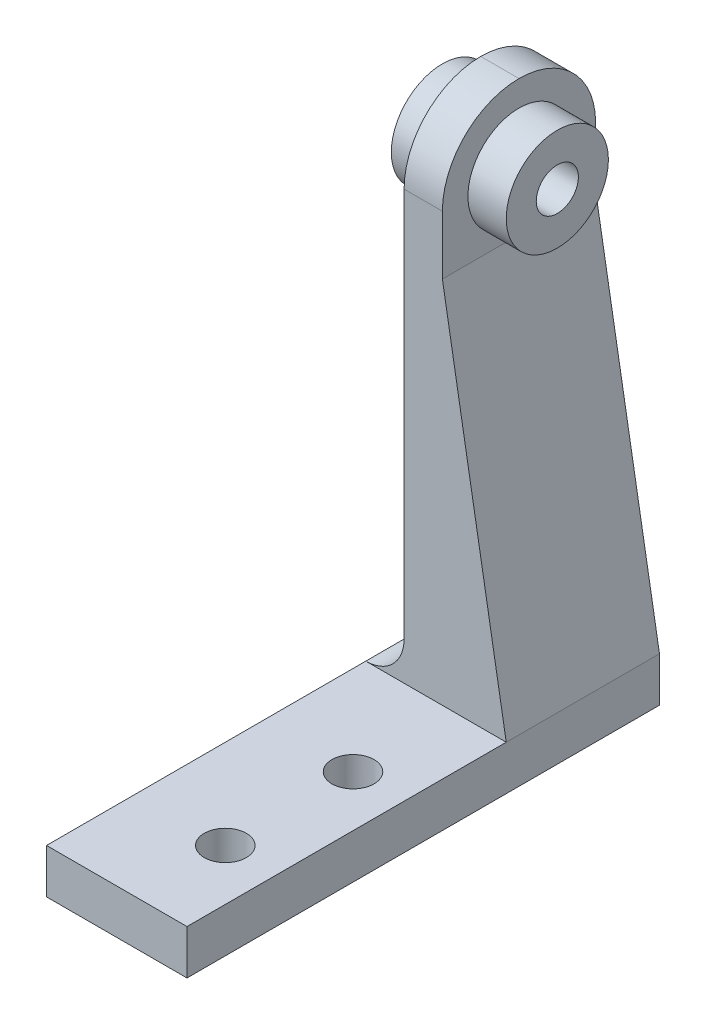
ISO-10303-21;
HEADER;
FILE_DESCRIPTION(('STEP AP214'),'2;1');
FILE_NAME('part.step','',(''),(''),'','','');
FILE_SCHEMA(('AUTOMOTIVE_DESIGN { 1 0 10303 214 1 1 1 1 }'));
ENDSEC;
DATA;
#1=APPLICATION_CONTEXT('core data for automotive mechanical design processes');
#2=APPLICATION_PROTOCOL_DEFINITION('international standard','automotive_design',2000,#1);
#3=PRODUCT_CONTEXT('',#1,'mechanical');
#4=PRODUCT('Part','Part','',(#3));
#5=PRODUCT_RELATED_PRODUCT_CATEGORY('part','',(#4));
#6=PRODUCT_DEFINITION_FORMATION('','',#4);
#7=PRODUCT_DEFINITION_CONTEXT('part definition',#1,'design');
#8=PRODUCT_DEFINITION('design','',#6,#7);
#9=PRODUCT_DEFINITION_SHAPE('','',#8);
#10=(LENGTH_UNIT() NAMED_UNIT(*) SI_UNIT(.MILLI.,.METRE.));
#11=(NAMED_UNIT(*) PLANE_ANGLE_UNIT() SI_UNIT($,.RADIAN.));
#12=(NAMED_UNIT(*) SI_UNIT($,.STERADIAN.) SOLID_ANGLE_UNIT());
#13=UNCERTAINTY_MEASURE_WITH_UNIT(LENGTH_MEASURE(1.E-05),#10,'distance_accuracy_value','');
#14=(GEOMETRIC_REPRESENTATION_CONTEXT(3) GLOBAL_UNCERTAINTY_ASSIGNED_CONTEXT((#13)) GLOBAL_UNIT_ASSIGNED_CONTEXT((#10,
#11,#12)) REPRESENTATION_CONTEXT('',''));
#15=CARTESIAN_POINT('',(0.,0.,0.));
#16=DIRECTION('',(0.,0.,1.));
#17=DIRECTION('',(1.,0.,0.));
#18=AXIS2_PLACEMENT_3D('',#15,#16,#17);
#19=CARTESIAN_POINT('',(3.,0.,0.));
#20=DIRECTION('',(1.,0.,0.));
#21=DIRECTION('',(0.,0.,-1.));
#22=AXIS2_PLACEMENT_3D('',#19,#20,#21);
#23=PLANE('',#22);
#24=CARTESIAN_POINT('',(3.,14.,0.));
#25=DIRECTION('',(1.,0.,0.));
#26=DIRECTION('',(0.,0.,-1.));
#27=AXIS2_PLACEMENT_3D('',#24,#25,#26);
#28=CIRCLE('',#27,4.);
#29=CARTESIAN_POINT('',(3.,14.,-4.));
#30=VERTEX_POINT('',#29);
#31=EDGE_CURVE('E172',#30,#30,#28,.T.);
#32=ORIENTED_EDGE('',*,*,#31,.F.);
#33=EDGE_LOOP('',(#32));
#34=FACE_BOUND('',#33,.T.);
#35=DIRECTION('',(0.,-1.,0.));
#36=VECTOR('',#35,1.);
#37=CARTESIAN_POINT('',(3.,20.,6.));
#38=LINE('',#37,#36);
#39=CARTESIAN_POINT('',(3.,14.,6.));
#40=VERTEX_POINT('',#39);
#41=CARTESIAN_POINT('',(3.,9.40062750597729,6.));
#42=VERTEX_POINT('',#41);
#43=EDGE_CURVE('E180',#40,#42,#38,.T.);
#44=ORIENTED_EDGE('',*,*,#43,.T.);
#45=DIRECTION('',(0.,0.,1.));
#46=VECTOR('',#45,1.);
#47=CARTESIAN_POINT('',(3.,9.40062750597729,6.));
#48=LINE('',#47,#46);
#49=CARTESIAN_POINT('',(3.,9.40062750597729,-6.));
#50=VERTEX_POINT('',#49);
#51=EDGE_CURVE('E209',#50,#42,#48,.T.);
#52=ORIENTED_EDGE('',*,*,#51,.F.);
#53=DIRECTION('',(0.,1.,0.));
#54=VECTOR('',#53,1.);
#55=CARTESIAN_POINT('',(3.,20.,-6.));
#56=LINE('',#55,#54);
#57=CARTESIAN_POINT('',(3.,14.,-6.));
#58=VERTEX_POINT('',#57);
#59=EDGE_CURVE('E138',#50,#58,#56,.T.);
#60=ORIENTED_EDGE('',*,*,#59,.T.);
#61=CARTESIAN_POINT('',(3.,14.,0.));
#62=DIRECTION('',(1.,0.,0.));
#63=DIRECTION('',(0.,0.,-1.));
#64=AXIS2_PLACEMENT_3D('',#61,#62,#63);
#65=CIRCLE('',#64,6.);
#66=CARTESIAN_POINT('',(3.,20.,0.));
#67=VERTEX_POINT('',#66);
#68=EDGE_CURVE('E196',#58,#67,#65,.T.);
#69=ORIENTED_EDGE('',*,*,#68,.T.);
#70=CARTESIAN_POINT('',(3.,14.,0.));
#71=DIRECTION('',(1.,0.,0.));
#72=DIRECTION('',(0.,0.,-1.));
#73=AXIS2_PLACEMENT_3D('',#70,#71,#72);
#74=CIRCLE('',#73,6.);
#75=EDGE_CURVE('E194',#67,#40,#74,.T.);
#76=ORIENTED_EDGE('',*,*,#75,.T.);
#77=EDGE_LOOP('',(#44,#52,#60,#69,#76));
#78=FACE_BOUND('',#77,.T.);
#79=ADVANCED_FACE('F43',(#34,#78),#23,.T.);
#80=CARTESIAN_POINT('',(3.,-19.5101273377847,31.));
#81=DIRECTION('',(0.,-1.,0.));
#82=DIRECTION('',(0.,0.,-1.));
#83=AXIS2_PLACEMENT_3D('',#80,#81,#82);
#84=PLANE('',#83);
#85=CARTESIAN_POINT('',(4.,-19.5101273377847,14.));
#86=DIRECTION('',(0.,1.,0.));
#87=DIRECTION('',(0.,0.,1.));
#88=AXIS2_PLACEMENT_3D('',#85,#86,#87);
#89=CIRCLE('',#88,1.65);
#90=CARTESIAN_POINT('',(4.,-19.5101273377847,15.65));
#91=VERTEX_POINT('',#90);
#92=EDGE_CURVE('E205',#91,#91,#89,.T.);
#93=ORIENTED_EDGE('',*,*,#92,.F.);
#94=EDGE_LOOP('',(#93));
#95=FACE_BOUND('',#94,.T.);
#96=CARTESIAN_POINT('',(4.,-19.5101273377847,24.));
#97=DIRECTION('',(0.,1.,0.));
#98=DIRECTION('',(0.,0.,1.));
#99=AXIS2_PLACEMENT_3D('',#96,#97,#98);
#100=CIRCLE('',#99,1.65);
#101=CARTESIAN_POINT('',(4.,-19.5101273377847,25.65));
#102=VERTEX_POINT('',#101);
#103=EDGE_CURVE('E131',#102,#102,#100,.T.);
#104=ORIENTED_EDGE('',*,*,#103,.F.);
#105=EDGE_LOOP('',(#104));
#106=FACE_BOUND('',#105,.T.);
#107=DIRECTION('',(-1.,0.,0.));
#108=VECTOR('',#107,1.);
#109=CARTESIAN_POINT('',(3.,-19.5101273377847,6.));
#110=LINE('',#109,#108);
#111=CARTESIAN_POINT('',(8.,-19.5101273377847,6.));
#112=VERTEX_POINT('',#111);
#113=CARTESIAN_POINT('',(-3.,-19.5101273377847,6.));
#114=VERTEX_POINT('',#113);
#115=EDGE_CURVE('E168',#112,#114,#110,.T.);
#116=ORIENTED_EDGE('',*,*,#115,.T.);
#117=DIRECTION('',(0.,0.,-1.));
#118=VECTOR('',#117,1.);
#119=CARTESIAN_POINT('',(-3.,-19.5101273377847,31.));
#120=LINE('',#119,#118);
#121=CARTESIAN_POINT('',(-3.,-19.5101273377847,31.));
#122=VERTEX_POINT('',#121);
#123=EDGE_CURVE('E223',#122,#114,#120,.T.);
#124=ORIENTED_EDGE('',*,*,#123,.F.);
#125=DIRECTION('',(-1.,0.,0.));
#126=VECTOR('',#125,1.);
#127=CARTESIAN_POINT('',(3.,-19.5101273377847,31.));
#128=LINE('',#127,#126);
#129=CARTESIAN_POINT('',(8.,-19.5101273377847,31.));
#130=VERTEX_POINT('',#129);
#131=EDGE_CURVE('E154',#130,#122,#128,.T.);
#132=ORIENTED_EDGE('',*,*,#131,.F.);
#133=DIRECTION('',(0.,0.,1.));
#134=VECTOR('',#133,1.);
#135=CARTESIAN_POINT('',(8.,-19.5101273377847,31.));
#136=LINE('',#135,#134);
#137=EDGE_CURVE('E145',#112,#130,#136,.T.);
#138=ORIENTED_EDGE('',*,*,#137,.F.);
#139=EDGE_LOOP('',(#116,#124,#132,#138));
#140=FACE_BOUND('',#139,.T.);
#141=ADVANCED_FACE('F264',(#95,#106,#140),#84,.F.);
#142=CARTESIAN_POINT('',(0.,0.,0.));
#143=DIRECTION('',(1.,0.,0.));
#144=DIRECTION('',(0.,0.,-1.));
#145=AXIS2_PLACEMENT_3D('',#142,#143,#144);
#146=PLANE('',#145);
#147=CARTESIAN_POINT('',(0.,14.,0.));
#148=DIRECTION('',(-1.,0.,0.));
#149=DIRECTION('',(0.,0.,1.));
#150=AXIS2_PLACEMENT_3D('',#147,#148,#149);
#151=CIRCLE('',#150,4.);
#152=CARTESIAN_POINT('',(0.,14.,4.));
#153=VERTEX_POINT('',#152);
#154=EDGE_CURVE('E165',#153,#153,#151,.T.);
#155=ORIENTED_EDGE('',*,*,#154,.F.);
#156=EDGE_LOOP('',(#155));
#157=FACE_BOUND('',#156,.T.);
#158=DIRECTION('',(0.,1.,0.));
#159=VECTOR('',#158,1.);
#160=CARTESIAN_POINT('',(0.,20.,-6.));
#161=LINE('',#160,#159);
#162=CARTESIAN_POINT('',(0.,-16.5101273377847,-6.));
#163=VERTEX_POINT('',#162);
#164=CARTESIAN_POINT('',(0.,14.,-6.));
#165=VERTEX_POINT('',#164);
#166=EDGE_CURVE('E185',#163,#165,#161,.T.);
#167=ORIENTED_EDGE('',*,*,#166,.F.);
#168=DIRECTION('',(0.,0.,-1.));
#169=VECTOR('',#168,1.);
#170=CARTESIAN_POINT('',(0.,-16.5101273377847,6.));
#171=LINE('',#170,#169);
#172=CARTESIAN_POINT('',(0.,-16.5101273377847,6.));
#173=VERTEX_POINT('',#172);
#174=EDGE_CURVE('E66',#163,#173,#171,.F.);
#175=ORIENTED_EDGE('',*,*,#174,.T.);
#176=DIRECTION('',(0.,-1.,0.));
#177=VECTOR('',#176,1.);
#178=CARTESIAN_POINT('',(0.,20.,6.));
#179=LINE('',#178,#177);
#180=CARTESIAN_POINT('',(0.,14.,6.));
#181=VERTEX_POINT('',#180);
#182=EDGE_CURVE('E181',#181,#173,#179,.T.);
#183=ORIENTED_EDGE('',*,*,#182,.F.);
#184=CARTESIAN_POINT('',(0.,14.,0.));
#185=DIRECTION('',(1.,0.,0.));
#186=DIRECTION('',(0.,0.,-1.));
#187=AXIS2_PLACEMENT_3D('',#184,#185,#186);
#188=CIRCLE('',#187,6.);
#189=CARTESIAN_POINT('',(0.,20.,0.));
#190=VERTEX_POINT('',#189);
#191=EDGE_CURVE('E184',#181,#190,#188,.F.);
#192=ORIENTED_EDGE('',*,*,#191,.T.);
#193=CARTESIAN_POINT('',(0.,14.,0.));
#194=DIRECTION('',(1.,0.,0.));
#195=DIRECTION('',(0.,0.,-1.));
#196=AXIS2_PLACEMENT_3D('',#193,#194,#195);
#197=CIRCLE('',#196,6.);
#198=EDGE_CURVE('E189',#190,#165,#197,.F.);
#199=ORIENTED_EDGE('',*,*,#198,.T.);
#200=EDGE_LOOP('',(#167,#175,#183,#192,#199));
#201=FACE_BOUND('',#200,.T.);
#202=ADVANCED_FACE('F252',(#157,#201),#146,.F.);
#203=CARTESIAN_POINT('',(3.,20.,6.));
#204=DIRECTION('',(0.,0.,-1.));
#205=DIRECTION('',(0.,1.,0.));
#206=AXIS2_PLACEMENT_3D('',#203,#204,#205);
#207=PLANE('',#206);
#208=ORIENTED_EDGE('',*,*,#115,.F.);
#209=DIRECTION('',(0.170416196104557,-0.985372173397064,0.));
#210=VECTOR('',#209,1.);
#211=CARTESIAN_POINT('',(3.,9.40062750597729,6.));
#212=LINE('',#211,#210);
#213=EDGE_CURVE('E127',#42,#112,#212,.T.);
#214=ORIENTED_EDGE('',*,*,#213,.F.);
#215=ORIENTED_EDGE('',*,*,#43,.F.);
#216=DIRECTION('',(-1.,0.,0.));
#217=VECTOR('',#216,1.);
#218=CARTESIAN_POINT('',(3.,14.,6.));
#219=LINE('',#218,#217);
#220=EDGE_CURVE('E169',#40,#181,#219,.T.);
#221=ORIENTED_EDGE('',*,*,#220,.T.);
#222=ORIENTED_EDGE('',*,*,#182,.T.);
#223=CARTESIAN_POINT('',(-3.,-16.5101273377847,6.));
#224=DIRECTION('',(0.,0.,-1.));
#225=DIRECTION('',(0.,1.,0.));
#226=AXIS2_PLACEMENT_3D('',#223,#224,#225);
#227=CIRCLE('',#226,3.);
#228=EDGE_CURVE('E12',#173,#114,#227,.T.);
#229=ORIENTED_EDGE('',*,*,#228,.T.);
#230=EDGE_LOOP('',(#208,#214,#215,#221,#222,#229));
#231=FACE_BOUND('',#230,.T.);
#232=ADVANCED_FACE('F248',(#231),#207,.F.);
#233=CARTESIAN_POINT('',(3.,20.,-6.));
#234=DIRECTION('',(0.,0.,1.));
#235=DIRECTION('',(0.,-1.,0.));
#236=AXIS2_PLACEMENT_3D('',#233,#234,#235);
#237=PLANE('',#236);
#238=ORIENTED_EDGE('',*,*,#59,.F.);
#239=DIRECTION('',(0.170416196104557,-0.985372173397064,0.));
#240=VECTOR('',#239,1.);
#241=CARTESIAN_POINT('',(3.,9.40062750597729,-6.));
#242=LINE('',#241,#240);
#243=CARTESIAN_POINT('',(8.,-19.5101273377847,-6.));
#244=VERTEX_POINT('',#243);
#245=EDGE_CURVE('E124',#50,#244,#242,.T.);
#246=ORIENTED_EDGE('',*,*,#245,.T.);
#247=DIRECTION('',(0.,1.,0.));
#248=VECTOR('',#247,1.);
#249=CARTESIAN_POINT('',(8.,-19.5101273377847,-6.));
#250=LINE('',#249,#248);
#251=CARTESIAN_POINT('',(8.,-23.,-6.));
#252=VERTEX_POINT('',#251);
#253=EDGE_CURVE('E136',#252,#244,#250,.T.);
#254=ORIENTED_EDGE('',*,*,#253,.F.);
#255=DIRECTION('',(1.,0.,0.));
#256=VECTOR('',#255,1.);
#257=CARTESIAN_POINT('',(0.,-23.,-6.));
#258=LINE('',#257,#256);
#259=CARTESIAN_POINT('',(-3.,-23.,-6.));
#260=VERTEX_POINT('',#259);
#261=EDGE_CURVE('E156',#260,#252,#258,.T.);
#262=ORIENTED_EDGE('',*,*,#261,.F.);
#263=DIRECTION('',(0.,-1.,0.));
#264=VECTOR('',#263,1.);
#265=CARTESIAN_POINT('',(-3.,-19.5101273377847,-6.));
#266=LINE('',#265,#264);
#267=CARTESIAN_POINT('',(-3.,-19.5101273377847,-6.));
#268=VERTEX_POINT('',#267);
#269=EDGE_CURVE('E226',#268,#260,#266,.T.);
#270=ORIENTED_EDGE('',*,*,#269,.F.);
#271=CARTESIAN_POINT('',(-3.,-16.5101273377847,-6.00000000000001));
#272=DIRECTION('',(0.,0.,1.));
#273=DIRECTION('',(0.,-1.,0.));
#274=AXIS2_PLACEMENT_3D('',#271,#272,#273);
#275=CIRCLE('',#274,3.);
#276=EDGE_CURVE('E52',#268,#163,#275,.T.);
#277=ORIENTED_EDGE('',*,*,#276,.T.);
#278=ORIENTED_EDGE('',*,*,#166,.T.);
#279=DIRECTION('',(-1.,0.,0.));
#280=VECTOR('',#279,1.);
#281=CARTESIAN_POINT('',(3.,14.,-6.));
#282=LINE('',#281,#280);
#283=EDGE_CURVE('E192',#165,#58,#282,.F.);
#284=ORIENTED_EDGE('',*,*,#283,.T.);
#285=EDGE_LOOP('',(#238,#246,#254,#262,#270,#277,#278,#284));
#286=FACE_BOUND('',#285,.T.);
#287=ADVANCED_FACE('F135',(#286),#237,.F.);
#288=CARTESIAN_POINT('',(3.,14.,0.));
#289=DIRECTION('',(-1.,0.,0.));
#290=DIRECTION('',(0.,0.,1.));
#291=AXIS2_PLACEMENT_3D('',#288,#289,#290);
#292=CYLINDRICAL_SURFACE('',#291,1.65);
#293=CARTESIAN_POINT('',(6.,14.,0.));
#294=DIRECTION('',(1.,0.,0.));
#295=DIRECTION('',(0.,0.,-1.));
#296=AXIS2_PLACEMENT_3D('',#293,#294,#295);
#297=CIRCLE('',#296,1.65);
#298=CARTESIAN_POINT('',(6.,14.,-1.65));
#299=VERTEX_POINT('',#298);
#300=EDGE_CURVE('E164',#299,#299,#297,.F.);
#301=ORIENTED_EDGE('',*,*,#300,.F.);
#302=EDGE_LOOP('',(#301));
#303=FACE_BOUND('',#302,.T.);
#304=CARTESIAN_POINT('',(-3.,14.,0.));
#305=DIRECTION('',(-1.,0.,0.));
#306=DIRECTION('',(0.,0.,1.));
#307=AXIS2_PLACEMENT_3D('',#304,#305,#306);
#308=CIRCLE('',#307,1.65);
#309=CARTESIAN_POINT('',(-3.,14.,1.65));
#310=VERTEX_POINT('',#309);
#311=EDGE_CURVE('E158',#310,#310,#308,.T.);
#312=ORIENTED_EDGE('',*,*,#311,.T.);
#313=EDGE_LOOP('',(#312));
#314=FACE_BOUND('',#313,.T.);
#315=ADVANCED_FACE('F276',(#303,#314),#292,.F.);
#316=CARTESIAN_POINT('',(3.,14.,0.));
#317=DIRECTION('',(-1.,0.,0.));
#318=DIRECTION('',(0.,0.,1.));
#319=AXIS2_PLACEMENT_3D('',#316,#317,#318);
#320=CYLINDRICAL_SURFACE('',#319,6.);
#321=ORIENTED_EDGE('',*,*,#220,.F.);
#322=ORIENTED_EDGE('',*,*,#75,.F.);
#323=DIRECTION('',(-1.,0.,0.));
#324=VECTOR('',#323,1.);
#325=CARTESIAN_POINT('',(3.,20.,0.));
#326=LINE('',#325,#324);
#327=EDGE_CURVE('E176',#190,#67,#326,.F.);
#328=ORIENTED_EDGE('',*,*,#327,.F.);
#329=ORIENTED_EDGE('',*,*,#191,.F.);
#330=EDGE_LOOP('',(#321,#322,#328,#329));
#331=FACE_BOUND('',#330,.T.);
#332=ADVANCED_FACE('F255',(#331),#320,.T.);
#333=CARTESIAN_POINT('',(3.,14.,0.));
#334=DIRECTION('',(-1.,0.,0.));
#335=DIRECTION('',(0.,0.,1.));
#336=AXIS2_PLACEMENT_3D('',#333,#334,#335);
#337=CYLINDRICAL_SURFACE('',#336,6.);
#338=ORIENTED_EDGE('',*,*,#68,.F.);
#339=ORIENTED_EDGE('',*,*,#283,.F.);
#340=ORIENTED_EDGE('',*,*,#198,.F.);
#341=ORIENTED_EDGE('',*,*,#327,.T.);
#342=EDGE_LOOP('',(#338,#339,#340,#341));
#343=FACE_BOUND('',#342,.T.);
#344=ADVANCED_FACE('F261',(#343),#337,.T.);
#345=CARTESIAN_POINT('',(6.,14.,0.));
#346=DIRECTION('',(-1.,0.,0.));
#347=DIRECTION('',(0.,0.,1.));
#348=AXIS2_PLACEMENT_3D('',#345,#346,#347);
#349=CYLINDRICAL_SURFACE('',#348,4.);
#350=CARTESIAN_POINT('',(6.,14.,0.));
#351=DIRECTION('',(1.,0.,0.));
#352=DIRECTION('',(0.,0.,-1.));
#353=AXIS2_PLACEMENT_3D('',#350,#351,#352);
#354=CIRCLE('',#353,4.);
#355=CARTESIAN_POINT('',(6.,14.,-4.));
#356=VERTEX_POINT('',#355);
#357=EDGE_CURVE('E173',#356,#356,#354,.T.);
#358=ORIENTED_EDGE('',*,*,#357,.F.);
#359=EDGE_LOOP('',(#358));
#360=FACE_BOUND('',#359,.T.);
#361=ORIENTED_EDGE('',*,*,#31,.T.);
#362=EDGE_LOOP('',(#361));
#363=FACE_BOUND('',#362,.T.);
#364=ADVANCED_FACE('F286',(#360,#363),#349,.T.);
#365=CARTESIAN_POINT('',(6.,14.,0.));
#366=DIRECTION('',(1.,0.,0.));
#367=DIRECTION('',(0.,0.,-1.));
#368=AXIS2_PLACEMENT_3D('',#365,#366,#367);
#369=PLANE('',#368);
#370=ORIENTED_EDGE('',*,*,#300,.T.);
#371=EDGE_LOOP('',(#370));
#372=FACE_BOUND('',#371,.T.);
#373=ORIENTED_EDGE('',*,*,#357,.T.);
#374=EDGE_LOOP('',(#373));
#375=FACE_BOUND('',#374,.T.);
#376=ADVANCED_FACE('F302',(#372,#375),#369,.T.);
#377=CARTESIAN_POINT('',(-3.,14.,0.));
#378=DIRECTION('',(-1.,0.,0.));
#379=DIRECTION('',(0.,0.,1.));
#380=AXIS2_PLACEMENT_3D('',#377,#378,#379);
#381=PLANE('',#380);
#382=CARTESIAN_POINT('',(-3.,14.,0.));
#383=DIRECTION('',(-1.,0.,0.));
#384=DIRECTION('',(0.,0.,1.));
#385=AXIS2_PLACEMENT_3D('',#382,#383,#384);
#386=CIRCLE('',#385,4.);
#387=CARTESIAN_POINT('',(-3.,14.,4.));
#388=VERTEX_POINT('',#387);
#389=EDGE_CURVE('E161',#388,#388,#386,.T.);
#390=ORIENTED_EDGE('',*,*,#389,.T.);
#391=EDGE_LOOP('',(#390));
#392=FACE_BOUND('',#391,.T.);
#393=ORIENTED_EDGE('',*,*,#311,.F.);
#394=EDGE_LOOP('',(#393));
#395=FACE_BOUND('',#394,.T.);
#396=ADVANCED_FACE('F299',(#392,#395),#381,.T.);
#397=CARTESIAN_POINT('',(-3.,14.,0.));
#398=DIRECTION('',(1.,0.,0.));
#399=DIRECTION('',(0.,0.,-1.));
#400=AXIS2_PLACEMENT_3D('',#397,#398,#399);
#401=CYLINDRICAL_SURFACE('',#400,4.);
#402=ORIENTED_EDGE('',*,*,#389,.F.);
#403=EDGE_LOOP('',(#402));
#404=FACE_BOUND('',#403,.T.);
#405=ORIENTED_EDGE('',*,*,#154,.T.);
#406=EDGE_LOOP('',(#405));
#407=FACE_BOUND('',#406,.T.);
#408=ADVANCED_FACE('F301',(#404,#407),#401,.T.);
#409=CARTESIAN_POINT('',(0.,-23.,0.));
#410=DIRECTION('',(0.,-1.,0.));
#411=DIRECTION('',(0.,0.,-1.));
#412=AXIS2_PLACEMENT_3D('',#409,#410,#411);
#413=PLANE('',#412);
#414=CARTESIAN_POINT('',(4.,-23.,14.));
#415=DIRECTION('',(0.,-1.,0.));
#416=DIRECTION('',(0.,0.,-1.));
#417=AXIS2_PLACEMENT_3D('',#414,#415,#416);
#418=CIRCLE('',#417,1.65);
#419=CARTESIAN_POINT('',(4.,-23.,12.35));
#420=VERTEX_POINT('',#419);
#421=EDGE_CURVE('E47',#420,#420,#418,.T.);
#422=ORIENTED_EDGE('',*,*,#421,.F.);
#423=EDGE_LOOP('',(#422));
#424=FACE_BOUND('',#423,.T.);
#425=CARTESIAN_POINT('',(4.,-23.,24.));
#426=DIRECTION('',(0.,-1.,0.));
#427=DIRECTION('',(0.,0.,-1.));
#428=AXIS2_PLACEMENT_3D('',#425,#426,#427);
#429=CIRCLE('',#428,1.65);
#430=CARTESIAN_POINT('',(4.,-23.,22.35));
#431=VERTEX_POINT('',#430);
#432=EDGE_CURVE('E203',#431,#431,#429,.T.);
#433=ORIENTED_EDGE('',*,*,#432,.F.);
#434=EDGE_LOOP('',(#433));
#435=FACE_BOUND('',#434,.T.);
#436=DIRECTION('',(-1.,0.,0.));
#437=VECTOR('',#436,1.);
#438=CARTESIAN_POINT('',(3.,-23.,31.));
#439=LINE('',#438,#437);
#440=CARTESIAN_POINT('',(8.,-23.,31.));
#441=VERTEX_POINT('',#440);
#442=CARTESIAN_POINT('',(-3.,-23.,31.));
#443=VERTEX_POINT('',#442);
#444=EDGE_CURVE('E147',#441,#443,#439,.T.);
#445=ORIENTED_EDGE('',*,*,#444,.T.);
#446=DIRECTION('',(0.,0.,1.));
#447=VECTOR('',#446,1.);
#448=CARTESIAN_POINT('',(-3.,-23.,31.));
#449=LINE('',#448,#447);
#450=EDGE_CURVE('E229',#260,#443,#449,.T.);
#451=ORIENTED_EDGE('',*,*,#450,.F.);
#452=ORIENTED_EDGE('',*,*,#261,.T.);
#453=DIRECTION('',(0.,0.,-1.));
#454=VECTOR('',#453,1.);
#455=CARTESIAN_POINT('',(8.,-23.,31.));
#456=LINE('',#455,#454);
#457=EDGE_CURVE('E144',#441,#252,#456,.T.);
#458=ORIENTED_EDGE('',*,*,#457,.F.);
#459=EDGE_LOOP('',(#445,#451,#452,#458));
#460=FACE_BOUND('',#459,.T.);
#461=ADVANCED_FACE('F240',(#424,#435,#460),#413,.T.);
#462=CARTESIAN_POINT('',(0.,0.,31.));
#463=DIRECTION('',(0.,0.,1.));
#464=DIRECTION('',(1.,0.,0.));
#465=AXIS2_PLACEMENT_3D('',#462,#463,#464);
#466=PLANE('',#465);
#467=ORIENTED_EDGE('',*,*,#444,.F.);
#468=DIRECTION('',(0.,-1.,0.));
#469=VECTOR('',#468,1.);
#470=CARTESIAN_POINT('',(8.,-19.5101273377847,31.));
#471=LINE('',#470,#469);
#472=EDGE_CURVE('E149',#130,#441,#471,.T.);
#473=ORIENTED_EDGE('',*,*,#472,.F.);
#474=ORIENTED_EDGE('',*,*,#131,.T.);
#475=DIRECTION('',(0.,1.,0.));
#476=VECTOR('',#475,1.);
#477=CARTESIAN_POINT('',(-3.,-19.5101273377847,31.));
#478=LINE('',#477,#476);
#479=EDGE_CURVE('E219',#443,#122,#478,.T.);
#480=ORIENTED_EDGE('',*,*,#479,.F.);
#481=EDGE_LOOP('',(#467,#473,#474,#480));
#482=FACE_BOUND('',#481,.T.);
#483=ADVANCED_FACE('F235',(#482),#466,.T.);
#484=CARTESIAN_POINT('',(8.,0.,0.));
#485=DIRECTION('',(1.,0.,0.));
#486=DIRECTION('',(0.,0.,-1.));
#487=AXIS2_PLACEMENT_3D('',#484,#485,#486);
#488=PLANE('',#487);
#489=DIRECTION('',(0.,0.,1.));
#490=VECTOR('',#489,1.);
#491=CARTESIAN_POINT('',(8.,-19.5101273377847,-6.));
#492=LINE('',#491,#490);
#493=EDGE_CURVE('E121',#244,#112,#492,.T.);
#494=ORIENTED_EDGE('',*,*,#493,.T.);
#495=ORIENTED_EDGE('',*,*,#137,.T.);
#496=ORIENTED_EDGE('',*,*,#472,.T.);
#497=ORIENTED_EDGE('',*,*,#457,.T.);
#498=ORIENTED_EDGE('',*,*,#253,.T.);
#499=EDGE_LOOP('',(#494,#495,#496,#497,#498));
#500=FACE_BOUND('',#499,.T.);
#501=ADVANCED_FACE('F141',(#500),#488,.T.);
#502=CARTESIAN_POINT('',(-3.,0.,0.));
#503=DIRECTION('',(1.,0.,0.));
#504=DIRECTION('',(0.,0.,-1.));
#505=AXIS2_PLACEMENT_3D('',#502,#503,#504);
#506=PLANE('',#505);
#507=ORIENTED_EDGE('',*,*,#479,.T.);
#508=ORIENTED_EDGE('',*,*,#123,.T.);
#509=EDGE_CURVE('E222',#114,#268,#120,.T.);
#510=ORIENTED_EDGE('',*,*,#509,.T.);
#511=ORIENTED_EDGE('',*,*,#269,.T.);
#512=ORIENTED_EDGE('',*,*,#450,.T.);
#513=EDGE_LOOP('',(#507,#508,#510,#511,#512));
#514=FACE_BOUND('',#513,.T.);
#515=ADVANCED_FACE('F243',(#514),#506,.F.);
#516=CARTESIAN_POINT('',(-3.,-16.5101273377847,31.));
#517=DIRECTION('',(0.,0.,1.));
#518=DIRECTION('',(0.,-1.,0.));
#519=AXIS2_PLACEMENT_3D('',#516,#517,#518);
#520=CYLINDRICAL_SURFACE('',#519,3.);
#521=ORIENTED_EDGE('',*,*,#228,.F.);
#522=ORIENTED_EDGE('',*,*,#174,.F.);
#523=ORIENTED_EDGE('',*,*,#276,.F.);
#524=ORIENTED_EDGE('',*,*,#509,.F.);
#525=EDGE_LOOP('',(#521,#522,#523,#524));
#526=FACE_BOUND('',#525,.T.);
#527=ADVANCED_FACE('F45',(#526),#520,.F.);
#528=CARTESIAN_POINT('',(4.,-23.5101273377847,24.));
#529=DIRECTION('',(0.,1.,0.));
#530=DIRECTION('',(0.,0.,1.));
#531=AXIS2_PLACEMENT_3D('',#528,#529,#530);
#532=CYLINDRICAL_SURFACE('',#531,1.65);
#533=ORIENTED_EDGE('',*,*,#432,.T.);
#534=EDGE_LOOP('',(#533));
#535=FACE_BOUND('',#534,.T.);
#536=ORIENTED_EDGE('',*,*,#103,.T.);
#537=EDGE_LOOP('',(#536));
#538=FACE_BOUND('',#537,.T.);
#539=ADVANCED_FACE('F378',(#535,#538),#532,.F.);
#540=CARTESIAN_POINT('',(4.,-23.5101273377847,14.));
#541=DIRECTION('',(0.,1.,0.));
#542=DIRECTION('',(0.,0.,1.));
#543=AXIS2_PLACEMENT_3D('',#540,#541,#542);
#544=CYLINDRICAL_SURFACE('',#543,1.65);
#545=ORIENTED_EDGE('',*,*,#421,.T.);
#546=EDGE_LOOP('',(#545));
#547=FACE_BOUND('',#546,.T.);
#548=ORIENTED_EDGE('',*,*,#92,.T.);
#549=EDGE_LOOP('',(#548));
#550=FACE_BOUND('',#549,.T.);
#551=ADVANCED_FACE('F394',(#547,#550),#544,.F.);
#552=CARTESIAN_POINT('',(3.,9.40062750597729,-6.));
#553=DIRECTION('',(-0.985372173397064,-0.170416196104557,0.));
#554=DIRECTION('',(0.170416196104557,-0.985372173397064,0.));
#555=AXIS2_PLACEMENT_3D('',#552,#553,#554);
#556=PLANE('',#555);
#557=ORIENTED_EDGE('',*,*,#213,.T.);
#558=ORIENTED_EDGE('',*,*,#493,.F.);
#559=ORIENTED_EDGE('',*,*,#245,.F.);
#560=ORIENTED_EDGE('',*,*,#51,.T.);
#561=EDGE_LOOP('',(#557,#558,#559,#560));
#562=FACE_BOUND('',#561,.T.);
#563=ADVANCED_FACE('F123',(#562),#556,.F.);
#564=CLOSED_SHELL('',(#79,#141,#202,#232,#287,#315,#332,#344,#364,#376,#396,#408,#461,#483,#501,
#515,#527,#539,#551,#563));
#565=MANIFOLD_SOLID_BREP('B2',#564);
#566=ADVANCED_BREP_SHAPE_REPRESENTATION('',(#18,#565),#14);
#567=SHAPE_DEFINITION_REPRESENTATION(#9,#566);
ENDSEC;
END-ISO-10303-21;
